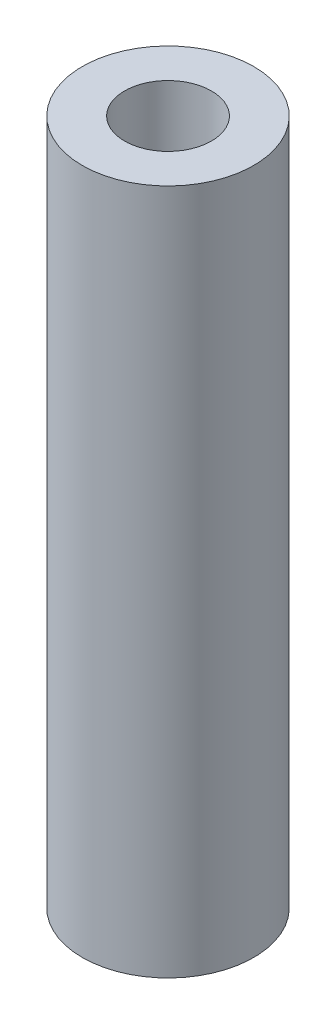
ISO-10303-21;
HEADER;
FILE_DESCRIPTION(('STEP AP214'),'2;1');
FILE_NAME('part.step','',(''),(''),'','','');
FILE_SCHEMA(('AUTOMOTIVE_DESIGN { 1 0 10303 214 1 1 1 1 }'));
ENDSEC;
DATA;
#1=APPLICATION_CONTEXT('core data for automotive mechanical design processes');
#2=APPLICATION_PROTOCOL_DEFINITION('international standard','automotive_design',2000,#1);
#3=PRODUCT_CONTEXT('',#1,'mechanical');
#4=PRODUCT('Part','Part','',(#3));
#5=PRODUCT_RELATED_PRODUCT_CATEGORY('part','',(#4));
#6=PRODUCT_DEFINITION_FORMATION('','',#4);
#7=PRODUCT_DEFINITION_CONTEXT('part definition',#1,'design');
#8=PRODUCT_DEFINITION('design','',#6,#7);
#9=PRODUCT_DEFINITION_SHAPE('','',#8);
#10=(LENGTH_UNIT() NAMED_UNIT(*) SI_UNIT(.MILLI.,.METRE.));
#11=(NAMED_UNIT(*) PLANE_ANGLE_UNIT() SI_UNIT($,.RADIAN.));
#12=(NAMED_UNIT(*) SI_UNIT($,.STERADIAN.) SOLID_ANGLE_UNIT());
#13=UNCERTAINTY_MEASURE_WITH_UNIT(LENGTH_MEASURE(1.E-05),#10,'distance_accuracy_value','');
#14=(GEOMETRIC_REPRESENTATION_CONTEXT(3) GLOBAL_UNCERTAINTY_ASSIGNED_CONTEXT((#13)) GLOBAL_UNIT_ASSIGNED_CONTEXT((#10,
#11,#12)) REPRESENTATION_CONTEXT('',''));
#15=CARTESIAN_POINT('',(0.,0.,0.));
#16=DIRECTION('',(0.,0.,1.));
#17=DIRECTION('',(1.,0.,0.));
#18=AXIS2_PLACEMENT_3D('',#15,#16,#17);
#19=CARTESIAN_POINT('',(0.,38.1,0.));
#20=DIRECTION('',(0.,1.,0.));
#21=DIRECTION('',(0.,0.,1.));
#22=AXIS2_PLACEMENT_3D('',#19,#20,#21);
#23=PLANE('',#22);
#24=CARTESIAN_POINT('',(0.,38.1,0.));
#25=DIRECTION('',(0.,1.,0.));
#26=DIRECTION('',(0.,0.,1.));
#27=AXIS2_PLACEMENT_3D('',#24,#25,#26);
#28=CIRCLE('',#27,4.7625);
#29=CARTESIAN_POINT('',(0.,38.1,-4.7625));
#30=VERTEX_POINT('',#29);
#31=EDGE_CURVE('E10',#30,#30,#28,.T.);
#32=ORIENTED_EDGE('',*,*,#31,.T.);
#33=EDGE_LOOP('',(#32));
#34=FACE_BOUND('',#33,.T.);
#35=CARTESIAN_POINT('',(0.,38.1,0.));
#36=DIRECTION('',(0.,1.,0.));
#37=DIRECTION('',(0.,0.,1.));
#38=AXIS2_PLACEMENT_3D('',#35,#36,#37);
#39=CIRCLE('',#38,2.413);
#40=CARTESIAN_POINT('',(0.,38.1,-2.413));
#41=VERTEX_POINT('',#40);
#42=EDGE_CURVE('E46',#41,#41,#39,.T.);
#43=ORIENTED_EDGE('',*,*,#42,.F.);
#44=EDGE_LOOP('',(#43));
#45=FACE_BOUND('',#44,.T.);
#46=ADVANCED_FACE('F35',(#34,#45),#23,.T.);
#47=CARTESIAN_POINT('',(0.,0.,0.));
#48=DIRECTION('',(0.,1.,0.));
#49=DIRECTION('',(0.,0.,1.));
#50=AXIS2_PLACEMENT_3D('',#47,#48,#49);
#51=PLANE('',#50);
#52=CARTESIAN_POINT('',(0.,0.,0.));
#53=DIRECTION('',(0.,1.,0.));
#54=DIRECTION('',(0.,0.,1.));
#55=AXIS2_PLACEMENT_3D('',#52,#53,#54);
#56=CIRCLE('',#55,4.7625);
#57=CARTESIAN_POINT('',(0.,0.,-4.7625));
#58=VERTEX_POINT('',#57);
#59=EDGE_CURVE('E39',#58,#58,#56,.T.);
#60=ORIENTED_EDGE('',*,*,#59,.F.);
#61=EDGE_LOOP('',(#60));
#62=FACE_BOUND('',#61,.T.);
#63=CARTESIAN_POINT('',(0.,0.,0.));
#64=DIRECTION('',(0.,1.,0.));
#65=DIRECTION('',(0.,0.,1.));
#66=AXIS2_PLACEMENT_3D('',#63,#64,#65);
#67=CIRCLE('',#66,2.413);
#68=CARTESIAN_POINT('',(0.,0.,-2.413));
#69=VERTEX_POINT('',#68);
#70=EDGE_CURVE('E48',#69,#69,#67,.T.);
#71=ORIENTED_EDGE('',*,*,#70,.T.);
#72=EDGE_LOOP('',(#71));
#73=FACE_BOUND('',#72,.T.);
#74=ADVANCED_FACE('F58',(#62,#73),#51,.F.);
#75=CARTESIAN_POINT('',(0.,38.1,0.));
#76=DIRECTION('',(0.,-1.,0.));
#77=DIRECTION('',(0.,0.,-1.));
#78=AXIS2_PLACEMENT_3D('',#75,#76,#77);
#79=CYLINDRICAL_SURFACE('',#78,4.7625);
#80=CARTESIAN_POINT('',(0.,38.1,-4.7625));
#81=CARTESIAN_POINT('',(0.,37.703125,-4.7625));
#82=CARTESIAN_POINT('',(0.,37.30625,-4.7625));
#83=CARTESIAN_POINT('',(0.,36.5125,-4.7625));
#84=CARTESIAN_POINT('',(0.,36.115625,-4.7625));
#85=CARTESIAN_POINT('',(0.,35.321875,-4.7625));
#86=CARTESIAN_POINT('',(0.,34.925,-4.7625));
#87=CARTESIAN_POINT('',(0.,34.13125,-4.7625));
#88=CARTESIAN_POINT('',(0.,33.734375,-4.7625));
#89=CARTESIAN_POINT('',(0.,32.940625,-4.7625));
#90=CARTESIAN_POINT('',(0.,32.54375,-4.7625));
#91=CARTESIAN_POINT('',(0.,31.75,-4.7625));
#92=CARTESIAN_POINT('',(0.,31.353125,-4.7625));
#93=CARTESIAN_POINT('',(0.,30.559375,-4.7625));
#94=CARTESIAN_POINT('',(0.,30.1625,-4.7625));
#95=CARTESIAN_POINT('',(0.,29.36875,-4.7625));
#96=CARTESIAN_POINT('',(0.,28.971875,-4.7625));
#97=CARTESIAN_POINT('',(0.,28.178125,-4.7625));
#98=CARTESIAN_POINT('',(0.,27.78125,-4.7625));
#99=CARTESIAN_POINT('',(0.,26.9875,-4.7625));
#100=CARTESIAN_POINT('',(0.,26.590625,-4.7625));
#101=CARTESIAN_POINT('',(0.,25.796875,-4.7625));
#102=CARTESIAN_POINT('',(0.,25.4,-4.7625));
#103=CARTESIAN_POINT('',(0.,24.60625,-4.7625));
#104=CARTESIAN_POINT('',(0.,24.209375,-4.7625));
#105=CARTESIAN_POINT('',(0.,23.415625,-4.7625));
#106=CARTESIAN_POINT('',(0.,23.01875,-4.7625));
#107=CARTESIAN_POINT('',(0.,22.225,-4.7625));
#108=CARTESIAN_POINT('',(0.,21.828125,-4.7625));
#109=CARTESIAN_POINT('',(0.,21.034375,-4.7625));
#110=CARTESIAN_POINT('',(0.,20.6375,-4.7625));
#111=CARTESIAN_POINT('',(0.,19.84375,-4.7625));
#112=CARTESIAN_POINT('',(0.,19.446875,-4.7625));
#113=CARTESIAN_POINT('',(0.,18.653125,-4.7625));
#114=CARTESIAN_POINT('',(0.,18.25625,-4.7625));
#115=CARTESIAN_POINT('',(0.,17.4625,-4.7625));
#116=CARTESIAN_POINT('',(0.,17.065625,-4.7625));
#117=CARTESIAN_POINT('',(0.,16.271875,-4.7625));
#118=CARTESIAN_POINT('',(0.,15.875,-4.7625));
#119=CARTESIAN_POINT('',(0.,15.08125,-4.7625));
#120=CARTESIAN_POINT('',(0.,14.684375,-4.7625));
#121=CARTESIAN_POINT('',(0.,13.890625,-4.7625));
#122=CARTESIAN_POINT('',(0.,13.49375,-4.7625));
#123=CARTESIAN_POINT('',(0.,12.7,-4.7625));
#124=CARTESIAN_POINT('',(0.,12.303125,-4.7625));
#125=CARTESIAN_POINT('',(0.,11.509375,-4.7625));
#126=CARTESIAN_POINT('',(0.,11.1125,-4.7625));
#127=CARTESIAN_POINT('',(0.,10.31875,-4.7625));
#128=CARTESIAN_POINT('',(0.,9.92187499999999,-4.7625));
#129=CARTESIAN_POINT('',(0.,9.128125,-4.7625));
#130=CARTESIAN_POINT('',(0.,8.73124999999999,-4.7625));
#131=CARTESIAN_POINT('',(0.,7.93749999999999,-4.7625));
#132=CARTESIAN_POINT('',(0.,7.54062499999999,-4.7625));
#133=CARTESIAN_POINT('',(0.,6.746875,-4.7625));
#134=CARTESIAN_POINT('',(0.,6.35,-4.7625));
#135=CARTESIAN_POINT('',(0.,5.55625,-4.7625));
#136=CARTESIAN_POINT('',(0.,5.159375,-4.7625));
#137=CARTESIAN_POINT('',(0.,4.365625,-4.7625));
#138=CARTESIAN_POINT('',(0.,3.96875,-4.7625));
#139=CARTESIAN_POINT('',(0.,3.175,-4.7625));
#140=CARTESIAN_POINT('',(0.,2.778125,-4.7625));
#141=CARTESIAN_POINT('',(0.,1.984375,-4.7625));
#142=CARTESIAN_POINT('',(0.,1.5875,-4.7625));
#143=CARTESIAN_POINT('',(0.,0.79375,-4.7625));
#144=CARTESIAN_POINT('',(0.,0.396875,-4.7625));
#145=CARTESIAN_POINT('',(0.,0.,-4.7625));
#146=B_SPLINE_CURVE_WITH_KNOTS('',3,(#80,#81,#82,#83,#84,#85,#86,#87,#88,#89,#90,#91,#92,#93,
#94,#95,#96,#97,#98,#99,#100,#101,#102,#103,#104,#105,#106,#107,#108,#109,#110,#111,#112,#113,
#114,#115,#116,#117,#118,#119,#120,#121,#122,#123,#124,#125,#126,#127,#128,#129,#130,#131,#132,
#133,#134,#135,#136,#137,#138,#139,#140,#141,#142,#143,#144,#145),.UNSPECIFIED.,.F.,.F.,(4,2,2,
2,2,2,2,2,2,2,2,2,2,2,2,2,2,2,2,2,2,2,2,2,2,2,2,2,2,2,2,2,4),(0.,1.190625,2.38125,3.571875,
4.7625,5.953125,7.14375,8.334375,9.52500000000001,10.715625,11.90625,13.096875,14.2875,
15.478125,16.66875,17.859375,19.05,20.240625,21.43125,22.621875,23.8125,25.003125,26.19375,
27.384375,28.575,29.765625,30.95625,32.146875,33.3375,34.528125,35.71875,36.909375,38.1),.UNSPECIFIED.);
#147=EDGE_CURVE('BSEAM37',#30,#58,#146,.T.);
#148=ORIENTED_EDGE('',*,*,#31,.F.);
#149=ORIENTED_EDGE('',*,*,#59,.T.);
#150=ORIENTED_EDGE('',*,*,#147,.T.);
#151=ORIENTED_EDGE('',*,*,#147,.F.);
#152=EDGE_LOOP('',(#148,#150,#149,#151));
#153=FACE_BOUND('',#152,.T.);
#154=ADVANCED_FACE('F37',(#153),#79,.T.);
#155=CARTESIAN_POINT('',(0.,38.1,0.));
#156=DIRECTION('',(0.,-1.,0.));
#157=DIRECTION('',(0.,0.,-1.));
#158=AXIS2_PLACEMENT_3D('',#155,#156,#157);
#159=CYLINDRICAL_SURFACE('',#158,2.413);
#160=CARTESIAN_POINT('',(0.,38.1,-2.413));
#161=CARTESIAN_POINT('',(0.,37.703125,-2.413));
#162=CARTESIAN_POINT('',(0.,37.30625,-2.413));
#163=CARTESIAN_POINT('',(0.,36.5125,-2.413));
#164=CARTESIAN_POINT('',(0.,36.115625,-2.413));
#165=CARTESIAN_POINT('',(0.,35.321875,-2.413));
#166=CARTESIAN_POINT('',(0.,34.925,-2.413));
#167=CARTESIAN_POINT('',(0.,34.13125,-2.413));
#168=CARTESIAN_POINT('',(0.,33.734375,-2.413));
#169=CARTESIAN_POINT('',(0.,32.940625,-2.413));
#170=CARTESIAN_POINT('',(0.,32.54375,-2.413));
#171=CARTESIAN_POINT('',(0.,31.75,-2.413));
#172=CARTESIAN_POINT('',(0.,31.353125,-2.413));
#173=CARTESIAN_POINT('',(0.,30.559375,-2.413));
#174=CARTESIAN_POINT('',(0.,30.1625,-2.413));
#175=CARTESIAN_POINT('',(0.,29.36875,-2.413));
#176=CARTESIAN_POINT('',(0.,28.971875,-2.413));
#177=CARTESIAN_POINT('',(0.,28.178125,-2.413));
#178=CARTESIAN_POINT('',(0.,27.78125,-2.413));
#179=CARTESIAN_POINT('',(0.,26.9875,-2.413));
#180=CARTESIAN_POINT('',(0.,26.590625,-2.413));
#181=CARTESIAN_POINT('',(0.,25.796875,-2.413));
#182=CARTESIAN_POINT('',(0.,25.4,-2.413));
#183=CARTESIAN_POINT('',(0.,24.60625,-2.413));
#184=CARTESIAN_POINT('',(0.,24.209375,-2.413));
#185=CARTESIAN_POINT('',(0.,23.415625,-2.413));
#186=CARTESIAN_POINT('',(0.,23.01875,-2.413));
#187=CARTESIAN_POINT('',(0.,22.225,-2.413));
#188=CARTESIAN_POINT('',(0.,21.828125,-2.413));
#189=CARTESIAN_POINT('',(0.,21.034375,-2.413));
#190=CARTESIAN_POINT('',(0.,20.6375,-2.413));
#191=CARTESIAN_POINT('',(0.,19.84375,-2.413));
#192=CARTESIAN_POINT('',(0.,19.446875,-2.413));
#193=CARTESIAN_POINT('',(0.,18.653125,-2.413));
#194=CARTESIAN_POINT('',(0.,18.25625,-2.413));
#195=CARTESIAN_POINT('',(0.,17.4625,-2.413));
#196=CARTESIAN_POINT('',(0.,17.065625,-2.413));
#197=CARTESIAN_POINT('',(0.,16.271875,-2.413));
#198=CARTESIAN_POINT('',(0.,15.875,-2.413));
#199=CARTESIAN_POINT('',(0.,15.08125,-2.413));
#200=CARTESIAN_POINT('',(0.,14.684375,-2.413));
#201=CARTESIAN_POINT('',(0.,13.890625,-2.413));
#202=CARTESIAN_POINT('',(0.,13.49375,-2.413));
#203=CARTESIAN_POINT('',(0.,12.7,-2.413));
#204=CARTESIAN_POINT('',(0.,12.303125,-2.413));
#205=CARTESIAN_POINT('',(0.,11.509375,-2.413));
#206=CARTESIAN_POINT('',(0.,11.1125,-2.413));
#207=CARTESIAN_POINT('',(0.,10.31875,-2.413));
#208=CARTESIAN_POINT('',(0.,9.92187499999999,-2.413));
#209=CARTESIAN_POINT('',(0.,9.128125,-2.413));
#210=CARTESIAN_POINT('',(0.,8.73124999999999,-2.413));
#211=CARTESIAN_POINT('',(0.,7.93749999999999,-2.413));
#212=CARTESIAN_POINT('',(0.,7.54062499999999,-2.413));
#213=CARTESIAN_POINT('',(0.,6.746875,-2.413));
#214=CARTESIAN_POINT('',(0.,6.35,-2.413));
#215=CARTESIAN_POINT('',(0.,5.55625,-2.413));
#216=CARTESIAN_POINT('',(0.,5.159375,-2.413));
#217=CARTESIAN_POINT('',(0.,4.365625,-2.413));
#218=CARTESIAN_POINT('',(0.,3.96875,-2.413));
#219=CARTESIAN_POINT('',(0.,3.175,-2.413));
#220=CARTESIAN_POINT('',(0.,2.778125,-2.413));
#221=CARTESIAN_POINT('',(0.,1.984375,-2.413));
#222=CARTESIAN_POINT('',(0.,1.5875,-2.413));
#223=CARTESIAN_POINT('',(0.,0.79375,-2.413));
#224=CARTESIAN_POINT('',(0.,0.396875,-2.413));
#225=CARTESIAN_POINT('',(0.,0.,-2.413));
#226=B_SPLINE_CURVE_WITH_KNOTS('',3,(#160,#161,#162,#163,#164,#165,#166,#167,#168,#169,#170,
#171,#172,#173,#174,#175,#176,#177,#178,#179,#180,#181,#182,#183,#184,#185,#186,#187,#188,#189,
#190,#191,#192,#193,#194,#195,#196,#197,#198,#199,#200,#201,#202,#203,#204,#205,#206,#207,#208,
#209,#210,#211,#212,#213,#214,#215,#216,#217,#218,#219,#220,#221,#222,#223,#224,#225),
.UNSPECIFIED.,.F.,.F.,(4,2,2,2,2,2,2,2,2,2,2,2,2,2,2,2,2,2,2,2,2,2,2,2,2,2,2,2,2,2,2,2,4),(0.,
1.190625,2.38125,3.571875,4.7625,5.953125,7.14375,8.334375,9.52500000000001,10.715625,11.90625,
13.096875,14.2875,15.478125,16.66875,17.859375,19.05,20.240625,21.43125,22.621875,23.8125,
25.003125,26.19375,27.384375,28.575,29.765625,30.95625,32.146875,33.3375,34.528125,35.71875,
36.909375,38.1),.UNSPECIFIED.);
#227=EDGE_CURVE('BSEAM54',#41,#69,#226,.T.);
#228=ORIENTED_EDGE('',*,*,#42,.T.);
#229=ORIENTED_EDGE('',*,*,#70,.F.);
#230=ORIENTED_EDGE('',*,*,#227,.T.);
#231=ORIENTED_EDGE('',*,*,#227,.F.);
#232=EDGE_LOOP('',(#228,#230,#229,#231));
#233=FACE_BOUND('',#232,.T.);
#234=ADVANCED_FACE('F54',(#233),#159,.F.);
#235=CLOSED_SHELL('',(#46,#74,#154,#234));
#236=MANIFOLD_SOLID_BREP('B2',#235);
#237=ADVANCED_BREP_SHAPE_REPRESENTATION('',(#18,#236),#14);
#238=SHAPE_DEFINITION_REPRESENTATION(#9,#237);
ENDSEC;
END-ISO-10303-21;
